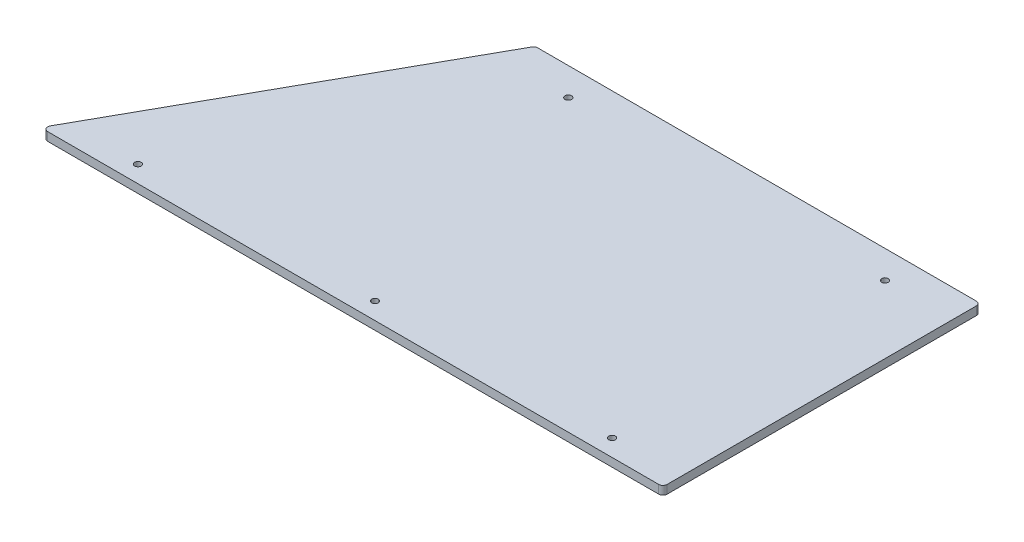
ISO-10303-21;
HEADER;
FILE_DESCRIPTION(('STEP AP214'),'2;1');
FILE_NAME('part.step','',(''),(''),'','','');
FILE_SCHEMA(('AUTOMOTIVE_DESIGN { 1 0 10303 214 1 1 1 1 }'));
ENDSEC;
DATA;
#1=APPLICATION_CONTEXT('core data for automotive mechanical design processes');
#2=APPLICATION_PROTOCOL_DEFINITION('international standard','automotive_design',2000,#1);
#3=PRODUCT_CONTEXT('',#1,'mechanical');
#4=PRODUCT('Part','Part','',(#3));
#5=PRODUCT_RELATED_PRODUCT_CATEGORY('part','',(#4));
#6=PRODUCT_DEFINITION_FORMATION('','',#4);
#7=PRODUCT_DEFINITION_CONTEXT('part definition',#1,'design');
#8=PRODUCT_DEFINITION('design','',#6,#7);
#9=PRODUCT_DEFINITION_SHAPE('','',#8);
#10=(LENGTH_UNIT() NAMED_UNIT(*) SI_UNIT(.MILLI.,.METRE.));
#11=(NAMED_UNIT(*) PLANE_ANGLE_UNIT() SI_UNIT($,.RADIAN.));
#12=(NAMED_UNIT(*) SI_UNIT($,.STERADIAN.) SOLID_ANGLE_UNIT());
#13=UNCERTAINTY_MEASURE_WITH_UNIT(LENGTH_MEASURE(1.E-05),#10,'distance_accuracy_value','');
#14=(GEOMETRIC_REPRESENTATION_CONTEXT(3) GLOBAL_UNCERTAINTY_ASSIGNED_CONTEXT((#13)) GLOBAL_UNIT_ASSIGNED_CONTEXT((#10,
#11,#12)) REPRESENTATION_CONTEXT('',''));
#15=CARTESIAN_POINT('',(0.,0.,0.));
#16=DIRECTION('',(0.,0.,1.));
#17=DIRECTION('',(1.,0.,0.));
#18=AXIS2_PLACEMENT_3D('',#15,#16,#17);
#19=CARTESIAN_POINT('',(0.,6.35,0.));
#20=DIRECTION('',(0.,1.,0.));
#21=DIRECTION('',(0.,0.,1.));
#22=AXIS2_PLACEMENT_3D('',#19,#20,#21);
#23=PLANE('',#22);
#24=CARTESIAN_POINT('',(60.325,6.35,-12.7));
#25=DIRECTION('',(0.,1.,0.));
#26=DIRECTION('',(0.,0.,1.));
#27=AXIS2_PLACEMENT_3D('',#24,#25,#26);
#28=CIRCLE('',#27,2.45745);
#29=CARTESIAN_POINT('',(60.325,6.35,-10.24255));
#30=VERTEX_POINT('',#29);
#31=EDGE_CURVE('E200',#30,#30,#28,.T.);
#32=ORIENTED_EDGE('',*,*,#31,.F.);
#33=EDGE_LOOP('',(#32));
#34=FACE_BOUND('',#33,.T.);
#35=CARTESIAN_POINT('',(415.925,6.35,-12.7));
#36=DIRECTION('',(0.,1.,0.));
#37=DIRECTION('',(0.,0.,1.));
#38=AXIS2_PLACEMENT_3D('',#35,#36,#37);
#39=CIRCLE('',#38,2.45744999999996);
#40=CARTESIAN_POINT('',(415.925,6.35,-10.24255));
#41=VERTEX_POINT('',#40);
#42=EDGE_CURVE('E189',#41,#41,#39,.T.);
#43=ORIENTED_EDGE('',*,*,#42,.F.);
#44=EDGE_LOOP('',(#43));
#45=FACE_BOUND('',#44,.T.);
#46=DIRECTION('',(-0.487097705254162,0.,0.873347482698685));
#47=VECTOR('',#46,1.);
#48=CARTESIAN_POINT('',(0.,6.35,0.));
#49=LINE('',#48,#47);
#50=CARTESIAN_POINT('',(131.902732744387,6.35,-236.496535214182));
#51=VERTEX_POINT('',#50);
#52=CARTESIAN_POINT('',(2.63337218422856,6.35,-4.72153521418196));
#53=VERTEX_POINT('',#52);
#54=EDGE_CURVE('E144',#51,#53,#49,.T.);
#55=ORIENTED_EDGE('',*,*,#54,.T.);
#56=CARTESIAN_POINT('',(5.40625044179688,6.35,-3.175));
#57=DIRECTION('',(0.,1.,0.));
#58=DIRECTION('',(0.,0.,1.));
#59=AXIS2_PLACEMENT_3D('',#56,#57,#58);
#60=CIRCLE('',#59,3.175);
#61=CARTESIAN_POINT('',(5.40625044179688,6.35,0.));
#62=VERTEX_POINT('',#61);
#63=EDGE_CURVE('E163',#53,#62,#60,.T.);
#64=ORIENTED_EDGE('',*,*,#63,.T.);
#65=DIRECTION('',(1.,0.,0.));
#66=VECTOR('',#65,1.);
#67=CARTESIAN_POINT('',(466.725,6.35,0.));
#68=LINE('',#67,#66);
#69=CARTESIAN_POINT('',(463.55,6.35,0.));
#70=VERTEX_POINT('',#69);
#71=EDGE_CURVE('E127',#62,#70,#68,.T.);
#72=ORIENTED_EDGE('',*,*,#71,.T.);
#73=CARTESIAN_POINT('',(463.55,6.35,-3.17500000000001));
#74=DIRECTION('',(0.,1.,0.));
#75=DIRECTION('',(0.,0.,1.));
#76=AXIS2_PLACEMENT_3D('',#73,#74,#75);
#77=CIRCLE('',#76,3.175);
#78=CARTESIAN_POINT('',(466.725,6.35,-3.17500000000001));
#79=VERTEX_POINT('',#78);
#80=EDGE_CURVE('E158',#70,#79,#77,.T.);
#81=ORIENTED_EDGE('',*,*,#80,.T.);
#82=DIRECTION('',(0.,0.,-1.));
#83=VECTOR('',#82,1.);
#84=CARTESIAN_POINT('',(466.725,6.35,-238.125));
#85=LINE('',#84,#83);
#86=CARTESIAN_POINT('',(466.725,6.35,-234.95));
#87=VERTEX_POINT('',#86);
#88=EDGE_CURVE('E174',#79,#87,#85,.T.);
#89=ORIENTED_EDGE('',*,*,#88,.T.);
#90=CARTESIAN_POINT('',(463.55,6.35,-234.95));
#91=DIRECTION('',(0.,1.,0.));
#92=DIRECTION('',(0.,0.,1.));
#93=AXIS2_PLACEMENT_3D('',#90,#91,#92);
#94=CIRCLE('',#93,3.175);
#95=CARTESIAN_POINT('',(463.55,6.35,-238.125));
#96=VERTEX_POINT('',#95);
#97=EDGE_CURVE('E63',#87,#96,#94,.T.);
#98=ORIENTED_EDGE('',*,*,#97,.T.);
#99=DIRECTION('',(-1.,0.,0.));
#100=VECTOR('',#99,1.);
#101=CARTESIAN_POINT('',(132.810986876875,6.35,-238.125));
#102=LINE('',#101,#100);
#103=CARTESIAN_POINT('',(134.675611001956,6.35,-238.125));
#104=VERTEX_POINT('',#103);
#105=EDGE_CURVE('E182',#96,#104,#102,.T.);
#106=ORIENTED_EDGE('',*,*,#105,.T.);
#107=CARTESIAN_POINT('',(134.675611001956,6.35,-234.95));
#108=DIRECTION('',(0.,1.,0.));
#109=DIRECTION('',(0.,0.,1.));
#110=AXIS2_PLACEMENT_3D('',#107,#108,#109);
#111=CIRCLE('',#110,3.175);
#112=EDGE_CURVE('E161',#104,#51,#111,.T.);
#113=ORIENTED_EDGE('',*,*,#112,.T.);
#114=EDGE_LOOP('',(#55,#64,#72,#81,#89,#98,#106,#113));
#115=FACE_BOUND('',#114,.T.);
#116=CARTESIAN_POINT('',(415.925,6.35,-217.297));
#117=DIRECTION('',(0.,1.,0.));
#118=DIRECTION('',(0.,0.,1.));
#119=AXIS2_PLACEMENT_3D('',#116,#117,#118);
#120=CIRCLE('',#119,2.45744999999996);
#121=CARTESIAN_POINT('',(415.925,6.35,-214.83955));
#122=VERTEX_POINT('',#121);
#123=EDGE_CURVE('E135',#122,#122,#120,.T.);
#124=ORIENTED_EDGE('',*,*,#123,.F.);
#125=EDGE_LOOP('',(#124));
#126=FACE_BOUND('',#125,.T.);
#127=CARTESIAN_POINT('',(238.125,6.35,-12.7));
#128=DIRECTION('',(0.,1.,0.));
#129=DIRECTION('',(0.,0.,1.));
#130=AXIS2_PLACEMENT_3D('',#127,#128,#129);
#131=CIRCLE('',#130,2.45745000000002);
#132=CARTESIAN_POINT('',(238.125,6.35,-10.24255));
#133=VERTEX_POINT('',#132);
#134=EDGE_CURVE('E194',#133,#133,#131,.T.);
#135=ORIENTED_EDGE('',*,*,#134,.F.);
#136=EDGE_LOOP('',(#135));
#137=FACE_BOUND('',#136,.T.);
#138=CARTESIAN_POINT('',(178.449400022,6.35,-217.297));
#139=DIRECTION('',(0.,1.,0.));
#140=DIRECTION('',(0.,0.,1.));
#141=AXIS2_PLACEMENT_3D('',#138,#139,#140);
#142=CIRCLE('',#141,2.45744999999992);
#143=CARTESIAN_POINT('',(178.449400022,6.35,-214.83955));
#144=VERTEX_POINT('',#143);
#145=EDGE_CURVE('E206',#144,#144,#142,.T.);
#146=ORIENTED_EDGE('',*,*,#145,.F.);
#147=EDGE_LOOP('',(#146));
#148=FACE_BOUND('',#147,.T.);
#149=ADVANCED_FACE('F41',(#34,#45,#115,#126,#137,#148),#23,.T.);
#150=CARTESIAN_POINT('',(0.,0.,0.));
#151=DIRECTION('',(0.,1.,0.));
#152=DIRECTION('',(0.,0.,1.));
#153=AXIS2_PLACEMENT_3D('',#150,#151,#152);
#154=PLANE('',#153);
#155=DIRECTION('',(1.,0.,0.));
#156=VECTOR('',#155,1.);
#157=CARTESIAN_POINT('',(466.725,0.,0.));
#158=LINE('',#157,#156);
#159=CARTESIAN_POINT('',(5.40625044179688,0.,0.));
#160=VERTEX_POINT('',#159);
#161=CARTESIAN_POINT('',(463.55,0.,0.));
#162=VERTEX_POINT('',#161);
#163=EDGE_CURVE('E124',#160,#162,#158,.T.);
#164=ORIENTED_EDGE('',*,*,#163,.F.);
#165=CARTESIAN_POINT('',(5.40625044179688,0.,-3.175));
#166=DIRECTION('',(0.,1.,0.));
#167=DIRECTION('',(0.,0.,1.));
#168=AXIS2_PLACEMENT_3D('',#165,#166,#167);
#169=CIRCLE('',#168,3.175);
#170=CARTESIAN_POINT('',(2.63337218422856,0.,-4.72153521418196));
#171=VERTEX_POINT('',#170);
#172=EDGE_CURVE('E107',#160,#171,#169,.F.);
#173=ORIENTED_EDGE('',*,*,#172,.T.);
#174=DIRECTION('',(-0.487097705254162,0.,0.873347482698685));
#175=VECTOR('',#174,1.);
#176=CARTESIAN_POINT('',(0.,0.,0.));
#177=LINE('',#176,#175);
#178=CARTESIAN_POINT('',(131.902732744387,0.,-236.496535214182));
#179=VERTEX_POINT('',#178);
#180=EDGE_CURVE('E148',#179,#171,#177,.T.);
#181=ORIENTED_EDGE('',*,*,#180,.F.);
#182=CARTESIAN_POINT('',(134.675611001956,0.,-234.95));
#183=DIRECTION('',(0.,1.,0.));
#184=DIRECTION('',(0.,0.,1.));
#185=AXIS2_PLACEMENT_3D('',#182,#183,#184);
#186=CIRCLE('',#185,3.175);
#187=CARTESIAN_POINT('',(134.675611001956,0.,-238.125));
#188=VERTEX_POINT('',#187);
#189=EDGE_CURVE('E118',#179,#188,#186,.F.);
#190=ORIENTED_EDGE('',*,*,#189,.T.);
#191=DIRECTION('',(-1.,0.,0.));
#192=VECTOR('',#191,1.);
#193=CARTESIAN_POINT('',(132.810986876875,0.,-238.125));
#194=LINE('',#193,#192);
#195=CARTESIAN_POINT('',(463.55,0.,-238.125));
#196=VERTEX_POINT('',#195);
#197=EDGE_CURVE('E138',#196,#188,#194,.T.);
#198=ORIENTED_EDGE('',*,*,#197,.F.);
#199=CARTESIAN_POINT('',(463.55,0.,-234.95));
#200=DIRECTION('',(0.,1.,0.));
#201=DIRECTION('',(0.,0.,1.));
#202=AXIS2_PLACEMENT_3D('',#199,#200,#201);
#203=CIRCLE('',#202,3.175);
#204=CARTESIAN_POINT('',(466.725,0.,-234.95));
#205=VERTEX_POINT('',#204);
#206=EDGE_CURVE('E152',#196,#205,#203,.F.);
#207=ORIENTED_EDGE('',*,*,#206,.T.);
#208=DIRECTION('',(0.,0.,-1.));
#209=VECTOR('',#208,1.);
#210=CARTESIAN_POINT('',(466.725,0.,-238.125));
#211=LINE('',#210,#209);
#212=CARTESIAN_POINT('',(466.725,0.,-3.17500000000001));
#213=VERTEX_POINT('',#212);
#214=EDGE_CURVE('E134',#213,#205,#211,.T.);
#215=ORIENTED_EDGE('',*,*,#214,.F.);
#216=CARTESIAN_POINT('',(463.55,0.,-3.17500000000001));
#217=DIRECTION('',(0.,1.,0.));
#218=DIRECTION('',(0.,0.,1.));
#219=AXIS2_PLACEMENT_3D('',#216,#217,#218);
#220=CIRCLE('',#219,3.175);
#221=EDGE_CURVE('E128',#213,#162,#220,.F.);
#222=ORIENTED_EDGE('',*,*,#221,.T.);
#223=EDGE_LOOP('',(#164,#173,#181,#190,#198,#207,#215,#222));
#224=FACE_BOUND('',#223,.T.);
#225=CARTESIAN_POINT('',(415.925,0.,-217.297));
#226=DIRECTION('',(0.,1.,0.));
#227=DIRECTION('',(0.,0.,1.));
#228=AXIS2_PLACEMENT_3D('',#225,#226,#227);
#229=CIRCLE('',#228,2.45744999999996);
#230=CARTESIAN_POINT('',(415.925,0.,-214.83955));
#231=VERTEX_POINT('',#230);
#232=EDGE_CURVE('E141',#231,#231,#229,.T.);
#233=ORIENTED_EDGE('',*,*,#232,.T.);
#234=EDGE_LOOP('',(#233));
#235=FACE_BOUND('',#234,.T.);
#236=CARTESIAN_POINT('',(415.925,0.,-12.7));
#237=DIRECTION('',(0.,1.,0.));
#238=DIRECTION('',(0.,0.,1.));
#239=AXIS2_PLACEMENT_3D('',#236,#237,#238);
#240=CIRCLE('',#239,2.45744999999996);
#241=CARTESIAN_POINT('',(415.925,0.,-10.24255));
#242=VERTEX_POINT('',#241);
#243=EDGE_CURVE('E191',#242,#242,#240,.T.);
#244=ORIENTED_EDGE('',*,*,#243,.T.);
#245=EDGE_LOOP('',(#244));
#246=FACE_BOUND('',#245,.T.);
#247=CARTESIAN_POINT('',(238.125,0.,-12.7));
#248=DIRECTION('',(0.,1.,0.));
#249=DIRECTION('',(0.,0.,1.));
#250=AXIS2_PLACEMENT_3D('',#247,#248,#249);
#251=CIRCLE('',#250,2.45745000000002);
#252=CARTESIAN_POINT('',(238.125,0.,-10.24255));
#253=VERTEX_POINT('',#252);
#254=EDGE_CURVE('E197',#253,#253,#251,.T.);
#255=ORIENTED_EDGE('',*,*,#254,.T.);
#256=EDGE_LOOP('',(#255));
#257=FACE_BOUND('',#256,.T.);
#258=CARTESIAN_POINT('',(60.325,0.,-12.7));
#259=DIRECTION('',(0.,1.,0.));
#260=DIRECTION('',(0.,0.,1.));
#261=AXIS2_PLACEMENT_3D('',#258,#259,#260);
#262=CIRCLE('',#261,2.45745);
#263=CARTESIAN_POINT('',(60.325,0.,-10.24255));
#264=VERTEX_POINT('',#263);
#265=EDGE_CURVE('E203',#264,#264,#262,.T.);
#266=ORIENTED_EDGE('',*,*,#265,.T.);
#267=EDGE_LOOP('',(#266));
#268=FACE_BOUND('',#267,.T.);
#269=CARTESIAN_POINT('',(178.449400022,0.,-217.297));
#270=DIRECTION('',(0.,1.,0.));
#271=DIRECTION('',(0.,0.,1.));
#272=AXIS2_PLACEMENT_3D('',#269,#270,#271);
#273=CIRCLE('',#272,2.45744999999992);
#274=CARTESIAN_POINT('',(178.449400022,0.,-214.83955));
#275=VERTEX_POINT('',#274);
#276=EDGE_CURVE('E209',#275,#275,#273,.T.);
#277=ORIENTED_EDGE('',*,*,#276,.T.);
#278=EDGE_LOOP('',(#277));
#279=FACE_BOUND('',#278,.T.);
#280=ADVANCED_FACE('F131',(#224,#235,#246,#257,#268,#279),#154,.F.);
#281=CARTESIAN_POINT('',(466.725,6.35,0.));
#282=DIRECTION('',(0.,0.,-1.));
#283=DIRECTION('',(-1.,0.,0.));
#284=AXIS2_PLACEMENT_3D('',#281,#282,#283);
#285=PLANE('',#284);
#286=ORIENTED_EDGE('',*,*,#71,.F.);
#287=DIRECTION('',(0.,-1.,0.));
#288=VECTOR('',#287,1.);
#289=CARTESIAN_POINT('',(5.40625044179688,6.35,0.));
#290=LINE('',#289,#288);
#291=EDGE_CURVE('E111',#62,#160,#290,.T.);
#292=ORIENTED_EDGE('',*,*,#291,.T.);
#293=ORIENTED_EDGE('',*,*,#163,.T.);
#294=DIRECTION('',(0.,-1.,0.));
#295=VECTOR('',#294,1.);
#296=CARTESIAN_POINT('',(463.55,6.35,0.));
#297=LINE('',#296,#295);
#298=EDGE_CURVE('E129',#162,#70,#297,.F.);
#299=ORIENTED_EDGE('',*,*,#298,.T.);
#300=EDGE_LOOP('',(#286,#292,#293,#299));
#301=FACE_BOUND('',#300,.T.);
#302=ADVANCED_FACE('F123',(#301),#285,.F.);
#303=CARTESIAN_POINT('',(466.725,6.35,-238.125));
#304=DIRECTION('',(-1.,0.,0.));
#305=DIRECTION('',(0.,0.,1.));
#306=AXIS2_PLACEMENT_3D('',#303,#304,#305);
#307=PLANE('',#306);
#308=ORIENTED_EDGE('',*,*,#214,.T.);
#309=DIRECTION('',(0.,-1.,0.));
#310=VECTOR('',#309,1.);
#311=CARTESIAN_POINT('',(466.725,6.35,-234.95));
#312=LINE('',#311,#310);
#313=EDGE_CURVE('E11',#205,#87,#312,.F.);
#314=ORIENTED_EDGE('',*,*,#313,.T.);
#315=ORIENTED_EDGE('',*,*,#88,.F.);
#316=DIRECTION('',(0.,-1.,0.));
#317=VECTOR('',#316,1.);
#318=CARTESIAN_POINT('',(466.725,6.35,-3.17500000000001));
#319=LINE('',#318,#317);
#320=EDGE_CURVE('E49',#79,#213,#319,.T.);
#321=ORIENTED_EDGE('',*,*,#320,.T.);
#322=EDGE_LOOP('',(#308,#314,#315,#321));
#323=FACE_BOUND('',#322,.T.);
#324=ADVANCED_FACE('F172',(#323),#307,.F.);
#325=CARTESIAN_POINT('',(132.810986876875,6.35,-238.125));
#326=DIRECTION('',(0.,0.,1.));
#327=DIRECTION('',(1.,0.,0.));
#328=AXIS2_PLACEMENT_3D('',#325,#326,#327);
#329=PLANE('',#328);
#330=ORIENTED_EDGE('',*,*,#197,.T.);
#331=DIRECTION('',(0.,-1.,0.));
#332=VECTOR('',#331,1.);
#333=CARTESIAN_POINT('',(134.675611001956,6.35,-238.125));
#334=LINE('',#333,#332);
#335=EDGE_CURVE('E56',#188,#104,#334,.F.);
#336=ORIENTED_EDGE('',*,*,#335,.T.);
#337=ORIENTED_EDGE('',*,*,#105,.F.);
#338=DIRECTION('',(0.,-1.,0.));
#339=VECTOR('',#338,1.);
#340=CARTESIAN_POINT('',(463.55,6.35,-238.125));
#341=LINE('',#340,#339);
#342=EDGE_CURVE('E165',#96,#196,#341,.T.);
#343=ORIENTED_EDGE('',*,*,#342,.T.);
#344=EDGE_LOOP('',(#330,#336,#337,#343));
#345=FACE_BOUND('',#344,.T.);
#346=ADVANCED_FACE('F181',(#345),#329,.F.);
#347=CARTESIAN_POINT('',(0.,6.35,0.));
#348=DIRECTION('',(0.873347482698685,0.,0.487097705254161));
#349=DIRECTION('',(0.487097705254162,0.,-0.873347482698685));
#350=AXIS2_PLACEMENT_3D('',#347,#348,#349);
#351=PLANE('',#350);
#352=ORIENTED_EDGE('',*,*,#180,.T.);
#353=DIRECTION('',(0.,-1.,0.));
#354=VECTOR('',#353,1.);
#355=CARTESIAN_POINT('',(2.63337218422856,6.35,-4.72153521418196));
#356=LINE('',#355,#354);
#357=EDGE_CURVE('E112',#171,#53,#356,.F.);
#358=ORIENTED_EDGE('',*,*,#357,.T.);
#359=ORIENTED_EDGE('',*,*,#54,.F.);
#360=DIRECTION('',(0.,-1.,0.));
#361=VECTOR('',#360,1.);
#362=CARTESIAN_POINT('',(131.902732744387,6.35,-236.496535214182));
#363=LINE('',#362,#361);
#364=EDGE_CURVE('E117',#51,#179,#363,.T.);
#365=ORIENTED_EDGE('',*,*,#364,.T.);
#366=EDGE_LOOP('',(#352,#358,#359,#365));
#367=FACE_BOUND('',#366,.T.);
#368=ADVANCED_FACE('F232',(#367),#351,.F.);
#369=CARTESIAN_POINT('',(415.925,6.35,-217.297));
#370=DIRECTION('',(0.,-1.,0.));
#371=DIRECTION('',(0.,0.,-1.));
#372=AXIS2_PLACEMENT_3D('',#369,#370,#371);
#373=CYLINDRICAL_SURFACE('',#372,2.45744999999996);
#374=ORIENTED_EDGE('',*,*,#123,.T.);
#375=EDGE_LOOP('',(#374));
#376=FACE_BOUND('',#375,.T.);
#377=ORIENTED_EDGE('',*,*,#232,.F.);
#378=EDGE_LOOP('',(#377));
#379=FACE_BOUND('',#378,.T.);
#380=ADVANCED_FACE('F229',(#376,#379),#373,.F.);
#381=CARTESIAN_POINT('',(415.925,6.35,-12.7));
#382=DIRECTION('',(0.,-1.,0.));
#383=DIRECTION('',(0.,0.,-1.));
#384=AXIS2_PLACEMENT_3D('',#381,#382,#383);
#385=CYLINDRICAL_SURFACE('',#384,2.45744999999996);
#386=ORIENTED_EDGE('',*,*,#42,.T.);
#387=EDGE_LOOP('',(#386));
#388=FACE_BOUND('',#387,.T.);
#389=ORIENTED_EDGE('',*,*,#243,.F.);
#390=EDGE_LOOP('',(#389));
#391=FACE_BOUND('',#390,.T.);
#392=ADVANCED_FACE('F264',(#388,#391),#385,.F.);
#393=CARTESIAN_POINT('',(238.125,6.35,-12.7));
#394=DIRECTION('',(0.,-1.,0.));
#395=DIRECTION('',(0.,0.,-1.));
#396=AXIS2_PLACEMENT_3D('',#393,#394,#395);
#397=CYLINDRICAL_SURFACE('',#396,2.45745000000002);
#398=ORIENTED_EDGE('',*,*,#134,.T.);
#399=EDGE_LOOP('',(#398));
#400=FACE_BOUND('',#399,.T.);
#401=ORIENTED_EDGE('',*,*,#254,.F.);
#402=EDGE_LOOP('',(#401));
#403=FACE_BOUND('',#402,.T.);
#404=ADVANCED_FACE('F260',(#400,#403),#397,.F.);
#405=CARTESIAN_POINT('',(60.325,6.35,-12.7));
#406=DIRECTION('',(0.,-1.,0.));
#407=DIRECTION('',(0.,0.,-1.));
#408=AXIS2_PLACEMENT_3D('',#405,#406,#407);
#409=CYLINDRICAL_SURFACE('',#408,2.45745);
#410=ORIENTED_EDGE('',*,*,#31,.T.);
#411=EDGE_LOOP('',(#410));
#412=FACE_BOUND('',#411,.T.);
#413=ORIENTED_EDGE('',*,*,#265,.F.);
#414=EDGE_LOOP('',(#413));
#415=FACE_BOUND('',#414,.T.);
#416=ADVANCED_FACE('F263',(#412,#415),#409,.F.);
#417=CARTESIAN_POINT('',(178.449400022,6.35,-217.297));
#418=DIRECTION('',(0.,-1.,0.));
#419=DIRECTION('',(0.,0.,-1.));
#420=AXIS2_PLACEMENT_3D('',#417,#418,#419);
#421=CYLINDRICAL_SURFACE('',#420,2.45744999999992);
#422=ORIENTED_EDGE('',*,*,#145,.T.);
#423=EDGE_LOOP('',(#422));
#424=FACE_BOUND('',#423,.T.);
#425=ORIENTED_EDGE('',*,*,#276,.F.);
#426=EDGE_LOOP('',(#425));
#427=FACE_BOUND('',#426,.T.);
#428=ADVANCED_FACE('F215',(#424,#427),#421,.F.);
#429=CARTESIAN_POINT('',(5.40625044179688,6.35,-3.175));
#430=DIRECTION('',(0.,-1.,0.));
#431=DIRECTION('',(0.,0.,-1.));
#432=AXIS2_PLACEMENT_3D('',#429,#430,#431);
#433=CYLINDRICAL_SURFACE('',#432,3.175);
#434=ORIENTED_EDGE('',*,*,#63,.F.);
#435=ORIENTED_EDGE('',*,*,#357,.F.);
#436=ORIENTED_EDGE('',*,*,#172,.F.);
#437=ORIENTED_EDGE('',*,*,#291,.F.);
#438=EDGE_LOOP('',(#434,#435,#436,#437));
#439=FACE_BOUND('',#438,.T.);
#440=ADVANCED_FACE('F110',(#439),#433,.T.);
#441=CARTESIAN_POINT('',(134.675611001956,6.35,-234.95));
#442=DIRECTION('',(0.,-1.,0.));
#443=DIRECTION('',(0.,0.,-1.));
#444=AXIS2_PLACEMENT_3D('',#441,#442,#443);
#445=CYLINDRICAL_SURFACE('',#444,3.175);
#446=ORIENTED_EDGE('',*,*,#112,.F.);
#447=ORIENTED_EDGE('',*,*,#335,.F.);
#448=ORIENTED_EDGE('',*,*,#189,.F.);
#449=ORIENTED_EDGE('',*,*,#364,.F.);
#450=EDGE_LOOP('',(#446,#447,#448,#449));
#451=FACE_BOUND('',#450,.T.);
#452=ADVANCED_FACE('F244',(#451),#445,.T.);
#453=CARTESIAN_POINT('',(463.55,6.35,-234.95));
#454=DIRECTION('',(0.,-1.,0.));
#455=DIRECTION('',(0.,0.,-1.));
#456=AXIS2_PLACEMENT_3D('',#453,#454,#455);
#457=CYLINDRICAL_SURFACE('',#456,3.175);
#458=ORIENTED_EDGE('',*,*,#97,.F.);
#459=ORIENTED_EDGE('',*,*,#313,.F.);
#460=ORIENTED_EDGE('',*,*,#206,.F.);
#461=ORIENTED_EDGE('',*,*,#342,.F.);
#462=EDGE_LOOP('',(#458,#459,#460,#461));
#463=FACE_BOUND('',#462,.T.);
#464=ADVANCED_FACE('F180',(#463),#457,.T.);
#465=CARTESIAN_POINT('',(463.55,6.35,-3.17500000000001));
#466=DIRECTION('',(0.,-1.,0.));
#467=DIRECTION('',(0.,0.,-1.));
#468=AXIS2_PLACEMENT_3D('',#465,#466,#467);
#469=CYLINDRICAL_SURFACE('',#468,3.175);
#470=ORIENTED_EDGE('',*,*,#80,.F.);
#471=ORIENTED_EDGE('',*,*,#298,.F.);
#472=ORIENTED_EDGE('',*,*,#221,.F.);
#473=ORIENTED_EDGE('',*,*,#320,.F.);
#474=EDGE_LOOP('',(#470,#471,#472,#473));
#475=FACE_BOUND('',#474,.T.);
#476=ADVANCED_FACE('F43',(#475),#469,.T.);
#477=CLOSED_SHELL('',(#149,#280,#302,#324,#346,#368,#380,#392,#404,#416,#428,#440,#452,#464,#476));
#478=MANIFOLD_SOLID_BREP('B2',#477);
#479=ADVANCED_BREP_SHAPE_REPRESENTATION('',(#18,#478),#14);
#480=SHAPE_DEFINITION_REPRESENTATION(#9,#479);
ENDSEC;
END-ISO-10303-21;
